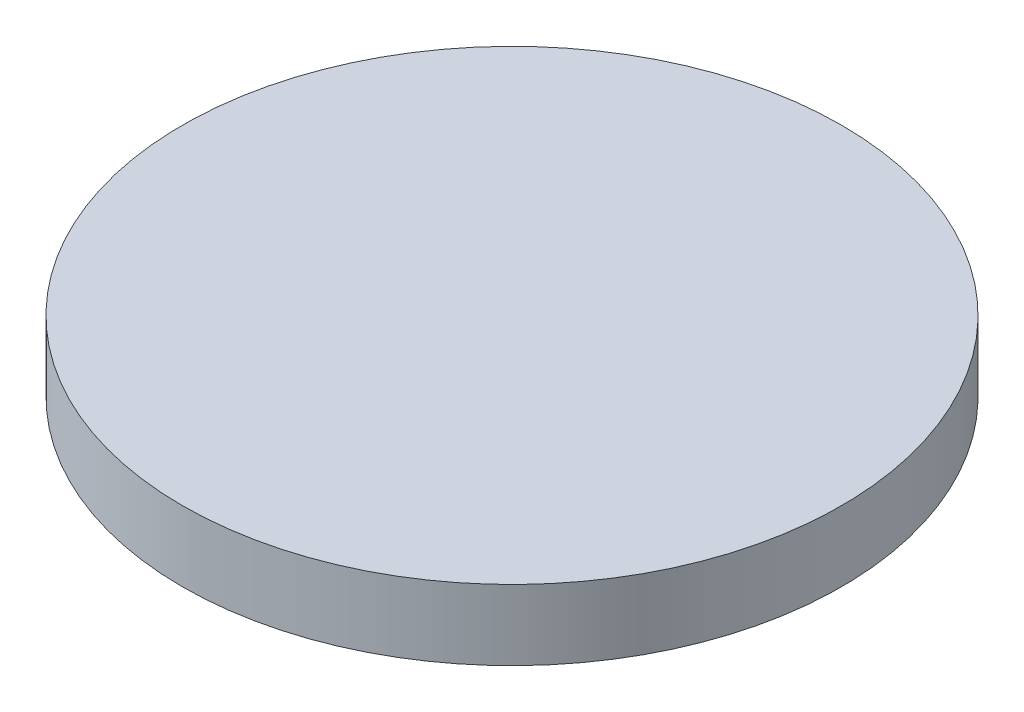
ISO-10303-21;
HEADER;
FILE_DESCRIPTION(('STEP AP214'),'2;1');
FILE_NAME('part.step','',(''),(''),'','','');
FILE_SCHEMA(('AUTOMOTIVE_DESIGN { 1 0 10303 214 1 1 1 1 }'));
ENDSEC;
DATA;
#1=APPLICATION_CONTEXT('core data for automotive mechanical design processes');
#2=APPLICATION_PROTOCOL_DEFINITION('international standard','automotive_design',2000,#1);
#3=PRODUCT_CONTEXT('',#1,'mechanical');
#4=PRODUCT('Part','Part','',(#3));
#5=PRODUCT_RELATED_PRODUCT_CATEGORY('part','',(#4));
#6=PRODUCT_DEFINITION_FORMATION('','',#4);
#7=PRODUCT_DEFINITION_CONTEXT('part definition',#1,'design');
#8=PRODUCT_DEFINITION('design','',#6,#7);
#9=PRODUCT_DEFINITION_SHAPE('','',#8);
#10=(LENGTH_UNIT() NAMED_UNIT(*) SI_UNIT(.MILLI.,.METRE.));
#11=(NAMED_UNIT(*) PLANE_ANGLE_UNIT() SI_UNIT($,.RADIAN.));
#12=(NAMED_UNIT(*) SI_UNIT($,.STERADIAN.) SOLID_ANGLE_UNIT());
#13=UNCERTAINTY_MEASURE_WITH_UNIT(LENGTH_MEASURE(1.E-05),#10,'distance_accuracy_value','');
#14=(GEOMETRIC_REPRESENTATION_CONTEXT(3) GLOBAL_UNCERTAINTY_ASSIGNED_CONTEXT((#13)) GLOBAL_UNIT_ASSIGNED_CONTEXT((#10,
#11,#12)) REPRESENTATION_CONTEXT('',''));
#15=CARTESIAN_POINT('',(0.,0.,0.));
#16=DIRECTION('',(0.,0.,1.));
#17=DIRECTION('',(1.,0.,0.));
#18=AXIS2_PLACEMENT_3D('',#15,#16,#17);
#19=CARTESIAN_POINT('',(0.,1.6,0.));
#20=DIRECTION('',(0.,-1.,0.));
#21=DIRECTION('',(0.,0.,-1.));
#22=AXIS2_PLACEMENT_3D('',#19,#20,#21);
#23=CYLINDRICAL_SURFACE('',#22,7.5);
#24=CARTESIAN_POINT('',(0.,1.6,0.));
#25=DIRECTION('',(0.,1.,0.));
#26=DIRECTION('',(0.,0.,1.));
#27=AXIS2_PLACEMENT_3D('',#24,#25,#26);
#28=CIRCLE('',#27,7.5);
#29=CARTESIAN_POINT('',(0.,1.6,7.5));
#30=VERTEX_POINT('',#29);
#31=EDGE_CURVE('E10',#30,#30,#28,.T.);
#32=ORIENTED_EDGE('',*,*,#31,.F.);
#33=EDGE_LOOP('',(#32));
#34=FACE_BOUND('',#33,.T.);
#35=CARTESIAN_POINT('',(0.,0.,0.));
#36=DIRECTION('',(0.,1.,0.));
#37=DIRECTION('',(0.,0.,1.));
#38=AXIS2_PLACEMENT_3D('',#35,#36,#37);
#39=CIRCLE('',#38,7.5);
#40=CARTESIAN_POINT('',(0.,0.,7.5));
#41=VERTEX_POINT('',#40);
#42=EDGE_CURVE('E40',#41,#41,#39,.T.);
#43=ORIENTED_EDGE('',*,*,#42,.T.);
#44=EDGE_LOOP('',(#43));
#45=FACE_BOUND('',#44,.T.);
#46=ADVANCED_FACE('F37',(#34,#45),#23,.T.);
#47=CARTESIAN_POINT('',(0.,1.6,0.));
#48=DIRECTION('',(0.,1.,0.));
#49=DIRECTION('',(0.,0.,1.));
#50=AXIS2_PLACEMENT_3D('',#47,#48,#49);
#51=PLANE('',#50);
#52=ORIENTED_EDGE('',*,*,#31,.T.);
#53=EDGE_LOOP('',(#52));
#54=FACE_BOUND('',#53,.T.);
#55=ADVANCED_FACE('F54',(#54),#51,.T.);
#56=CARTESIAN_POINT('',(0.,0.,0.));
#57=DIRECTION('',(0.,1.,0.));
#58=DIRECTION('',(0.,0.,1.));
#59=AXIS2_PLACEMENT_3D('',#56,#57,#58);
#60=PLANE('',#59);
#61=ORIENTED_EDGE('',*,*,#42,.F.);
#62=EDGE_LOOP('',(#61));
#63=FACE_BOUND('',#62,.T.);
#64=ADVANCED_FACE('F52',(#63),#60,.F.);
#65=CLOSED_SHELL('',(#46,#55,#64));
#66=MANIFOLD_SOLID_BREP('B2',#65);
#67=ADVANCED_BREP_SHAPE_REPRESENTATION('',(#18,#66),#14);
#68=SHAPE_DEFINITION_REPRESENTATION(#9,#67);
ENDSEC;
END-ISO-10303-21;
